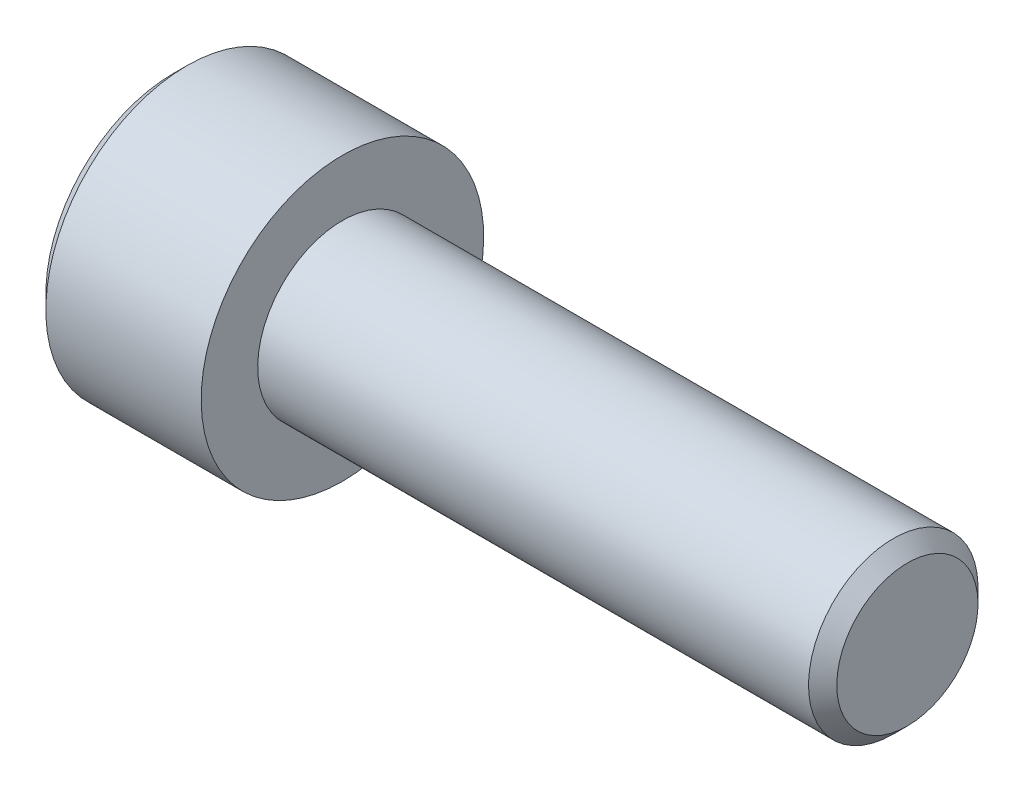
ISO-10303-21;
HEADER;
FILE_DESCRIPTION(('STEP AP214'),'2;1');
FILE_NAME('part.step','',(''),(''),'','','');
FILE_SCHEMA(('AUTOMOTIVE_DESIGN { 1 0 10303 214 1 1 1 1 }'));
ENDSEC;
DATA;
#1=APPLICATION_CONTEXT('core data for automotive mechanical design processes');
#2=APPLICATION_PROTOCOL_DEFINITION('international standard','automotive_design',2000,#1);
#3=PRODUCT_CONTEXT('',#1,'mechanical');
#4=PRODUCT('Part','Part','',(#3));
#5=PRODUCT_RELATED_PRODUCT_CATEGORY('part','',(#4));
#6=PRODUCT_DEFINITION_FORMATION('','',#4);
#7=PRODUCT_DEFINITION_CONTEXT('part definition',#1,'design');
#8=PRODUCT_DEFINITION('design','',#6,#7);
#9=PRODUCT_DEFINITION_SHAPE('','',#8);
#10=(LENGTH_UNIT() NAMED_UNIT(*) SI_UNIT(.MILLI.,.METRE.));
#11=(NAMED_UNIT(*) PLANE_ANGLE_UNIT() SI_UNIT($,.RADIAN.));
#12=(NAMED_UNIT(*) SI_UNIT($,.STERADIAN.) SOLID_ANGLE_UNIT());
#13=UNCERTAINTY_MEASURE_WITH_UNIT(LENGTH_MEASURE(1.E-05),#10,'distance_accuracy_value','');
#14=(GEOMETRIC_REPRESENTATION_CONTEXT(3) GLOBAL_UNCERTAINTY_ASSIGNED_CONTEXT((#13)) GLOBAL_UNIT_ASSIGNED_CONTEXT((#10,
#11,#12)) REPRESENTATION_CONTEXT('',''));
#15=CARTESIAN_POINT('',(0.,0.,0.));
#16=DIRECTION('',(0.,0.,1.));
#17=DIRECTION('',(1.,0.,0.));
#18=AXIS2_PLACEMENT_3D('',#15,#16,#17);
#19=CARTESIAN_POINT('',(-6.,0.,0.));
#20=DIRECTION('',(1.,0.,0.));
#21=DIRECTION('',(0.,1.,0.));
#22=AXIS2_PLACEMENT_3D('',#19,#20,#21);
#23=PLANE('',#22);
#24=CARTESIAN_POINT('',(-6.,0.,0.));
#25=DIRECTION('',(1.,0.,0.));
#26=DIRECTION('',(0.,1.,0.));
#27=AXIS2_PLACEMENT_3D('',#24,#25,#26);
#28=CIRCLE('',#27,4.49999999999999);
#29=CARTESIAN_POINT('',(-6.,4.49999999999999,0.));
#30=VERTEX_POINT('',#29);
#31=EDGE_CURVE('E40',#30,#30,#28,.F.);
#32=ORIENTED_EDGE('',*,*,#31,.T.);
#33=EDGE_LOOP('',(#32));
#34=FACE_BOUND('',#33,.T.);
#35=DIRECTION('',(0.,-0.5,-0.866025403784439));
#36=VECTOR('',#35,1.);
#37=CARTESIAN_POINT('',(-6.,2.88675134594813,0.));
#38=LINE('',#37,#36);
#39=CARTESIAN_POINT('',(-6.,2.88675134594813,0.));
#40=VERTEX_POINT('',#39);
#41=CARTESIAN_POINT('',(-6.,1.44337567297407,-2.5));
#42=VERTEX_POINT('',#41);
#43=EDGE_CURVE('E120',#40,#42,#38,.T.);
#44=ORIENTED_EDGE('',*,*,#43,.F.);
#45=DIRECTION('',(0.,0.5,-0.866025403784439));
#46=VECTOR('',#45,1.);
#47=CARTESIAN_POINT('',(-6.,1.44337567297407,2.5));
#48=LINE('',#47,#46);
#49=CARTESIAN_POINT('',(-6.,1.44337567297407,2.5));
#50=VERTEX_POINT('',#49);
#51=EDGE_CURVE('E47',#50,#40,#48,.T.);
#52=ORIENTED_EDGE('',*,*,#51,.F.);
#53=DIRECTION('',(0.,1.,0.));
#54=VECTOR('',#53,1.);
#55=CARTESIAN_POINT('',(-6.,-1.44337567297406,2.5));
#56=LINE('',#55,#54);
#57=CARTESIAN_POINT('',(-6.,-1.44337567297406,2.5));
#58=VERTEX_POINT('',#57);
#59=EDGE_CURVE('E106',#58,#50,#56,.T.);
#60=ORIENTED_EDGE('',*,*,#59,.F.);
#61=DIRECTION('',(0.,0.5,0.866025403784439));
#62=VECTOR('',#61,1.);
#63=CARTESIAN_POINT('',(-6.,-2.88675134594813,0.));
#64=LINE('',#63,#62);
#65=CARTESIAN_POINT('',(-6.,-2.88675134594813,0.));
#66=VERTEX_POINT('',#65);
#67=EDGE_CURVE('E109',#66,#58,#64,.T.);
#68=ORIENTED_EDGE('',*,*,#67,.F.);
#69=DIRECTION('',(0.,-0.5,0.866025403784439));
#70=VECTOR('',#69,1.);
#71=CARTESIAN_POINT('',(-6.,-1.44337567297406,-2.5));
#72=LINE('',#71,#70);
#73=CARTESIAN_POINT('',(-6.,-1.44337567297406,-2.5));
#74=VERTEX_POINT('',#73);
#75=EDGE_CURVE('E125',#74,#66,#72,.T.);
#76=ORIENTED_EDGE('',*,*,#75,.F.);
#77=DIRECTION('',(0.,-1.,0.));
#78=VECTOR('',#77,1.);
#79=CARTESIAN_POINT('',(-6.,1.44337567297407,-2.5));
#80=LINE('',#79,#78);
#81=EDGE_CURVE('E122',#42,#74,#80,.T.);
#82=ORIENTED_EDGE('',*,*,#81,.F.);
#83=EDGE_LOOP('',(#44,#52,#60,#68,#76,#82));
#84=FACE_BOUND('',#83,.T.);
#85=ADVANCED_FACE('F32',(#34,#84),#23,.F.);
#86=CARTESIAN_POINT('',(20.,0.,0.));
#87=DIRECTION('',(-1.,0.,0.));
#88=DIRECTION('',(0.,-1.,0.));
#89=AXIS2_PLACEMENT_3D('',#86,#87,#88);
#90=CYLINDRICAL_SURFACE('',#89,5.);
#91=CARTESIAN_POINT('',(-5.5,0.,0.));
#92=DIRECTION('',(1.,0.,0.));
#93=DIRECTION('',(0.,1.,0.));
#94=AXIS2_PLACEMENT_3D('',#91,#92,#93);
#95=CIRCLE('',#94,5.);
#96=CARTESIAN_POINT('',(-5.5,5.,0.));
#97=VERTEX_POINT('',#96);
#98=EDGE_CURVE('E11',#97,#97,#95,.T.);
#99=ORIENTED_EDGE('',*,*,#98,.T.);
#100=EDGE_LOOP('',(#99));
#101=FACE_BOUND('',#100,.T.);
#102=CARTESIAN_POINT('',(0.,0.,0.));
#103=DIRECTION('',(-1.,0.,0.));
#104=DIRECTION('',(0.,-1.,0.));
#105=AXIS2_PLACEMENT_3D('',#102,#103,#104);
#106=CIRCLE('',#105,5.);
#107=CARTESIAN_POINT('',(0.,-5.,0.));
#108=VERTEX_POINT('',#107);
#109=EDGE_CURVE('E145',#108,#108,#106,.T.);
#110=ORIENTED_EDGE('',*,*,#109,.T.);
#111=EDGE_LOOP('',(#110));
#112=FACE_BOUND('',#111,.T.);
#113=ADVANCED_FACE('F168',(#101,#112),#90,.T.);
#114=CARTESIAN_POINT('',(0.,5.,0.));
#115=DIRECTION('',(-1.,0.,0.));
#116=DIRECTION('',(0.,-1.,0.));
#117=AXIS2_PLACEMENT_3D('',#114,#115,#116);
#118=PLANE('',#117);
#119=ORIENTED_EDGE('',*,*,#109,.F.);
#120=EDGE_LOOP('',(#119));
#121=FACE_BOUND('',#120,.T.);
#122=CARTESIAN_POINT('',(0.,0.,0.));
#123=DIRECTION('',(-1.,0.,0.));
#124=DIRECTION('',(0.,-1.,0.));
#125=AXIS2_PLACEMENT_3D('',#122,#123,#124);
#126=CIRCLE('',#125,3.);
#127=CARTESIAN_POINT('',(0.,-3.,0.));
#128=VERTEX_POINT('',#127);
#129=EDGE_CURVE('E142',#128,#128,#126,.T.);
#130=ORIENTED_EDGE('',*,*,#129,.T.);
#131=EDGE_LOOP('',(#130));
#132=FACE_BOUND('',#131,.T.);
#133=ADVANCED_FACE('F173',(#121,#132),#118,.F.);
#134=CARTESIAN_POINT('',(20.,0.,0.));
#135=DIRECTION('',(-1.,0.,0.));
#136=DIRECTION('',(0.,-1.,0.));
#137=AXIS2_PLACEMENT_3D('',#134,#135,#136);
#138=CYLINDRICAL_SURFACE('',#137,3.);
#139=CARTESIAN_POINT('',(19.5,0.,0.));
#140=DIRECTION('',(-1.,0.,0.));
#141=DIRECTION('',(0.,-1.,0.));
#142=AXIS2_PLACEMENT_3D('',#139,#140,#141);
#143=CIRCLE('',#142,3.);
#144=CARTESIAN_POINT('',(19.5,-3.00000000000001,0.));
#145=VERTEX_POINT('',#144);
#146=EDGE_CURVE('E148',#145,#145,#143,.T.);
#147=ORIENTED_EDGE('',*,*,#146,.T.);
#148=EDGE_LOOP('',(#147));
#149=FACE_BOUND('',#148,.T.);
#150=ORIENTED_EDGE('',*,*,#129,.F.);
#151=EDGE_LOOP('',(#150));
#152=FACE_BOUND('',#151,.T.);
#153=ADVANCED_FACE('F179',(#149,#152),#138,.T.);
#154=CARTESIAN_POINT('',(20.,3.,0.));
#155=DIRECTION('',(-1.,0.,0.));
#156=DIRECTION('',(0.,-1.,0.));
#157=AXIS2_PLACEMENT_3D('',#154,#155,#156);
#158=PLANE('',#157);
#159=CARTESIAN_POINT('',(20.,0.,0.));
#160=DIRECTION('',(-1.,0.,0.));
#161=DIRECTION('',(0.,-1.,0.));
#162=AXIS2_PLACEMENT_3D('',#159,#160,#161);
#163=CIRCLE('',#162,2.49999999999999);
#164=CARTESIAN_POINT('',(20.,-2.5,0.));
#165=VERTEX_POINT('',#164);
#166=EDGE_CURVE('E151',#165,#165,#163,.F.);
#167=ORIENTED_EDGE('',*,*,#166,.T.);
#168=EDGE_LOOP('',(#167));
#169=FACE_BOUND('',#168,.T.);
#170=ADVANCED_FACE('F183',(#169),#158,.F.);
#171=CARTESIAN_POINT('',(-3.,1.44337567297407,2.5));
#172=DIRECTION('',(0.,0.866025403784439,0.5));
#173=DIRECTION('',(0.,-0.5,0.866025403784439));
#174=AXIS2_PLACEMENT_3D('',#171,#172,#173);
#175=PLANE('',#174);
#176=ORIENTED_EDGE('',*,*,#51,.T.);
#177=DIRECTION('',(-1.,0.,0.));
#178=VECTOR('',#177,1.);
#179=CARTESIAN_POINT('',(-3.,2.88675134594813,0.));
#180=LINE('',#179,#178);
#181=CARTESIAN_POINT('',(-3.,2.88675134594813,0.));
#182=VERTEX_POINT('',#181);
#183=EDGE_CURVE('E83',#182,#40,#180,.T.);
#184=ORIENTED_EDGE('',*,*,#183,.F.);
#185=DIRECTION('',(0.,0.5,-0.866025403784439));
#186=VECTOR('',#185,1.);
#187=CARTESIAN_POINT('',(-3.,1.44337567297407,2.5));
#188=LINE('',#187,#186);
#189=CARTESIAN_POINT('',(-3.,1.44337567297407,2.5));
#190=VERTEX_POINT('',#189);
#191=EDGE_CURVE('E87',#190,#182,#188,.T.);
#192=ORIENTED_EDGE('',*,*,#191,.F.);
#193=DIRECTION('',(-1.,0.,0.));
#194=VECTOR('',#193,1.);
#195=CARTESIAN_POINT('',(-3.,1.44337567297407,2.5));
#196=LINE('',#195,#194);
#197=EDGE_CURVE('E130',#190,#50,#196,.T.);
#198=ORIENTED_EDGE('',*,*,#197,.T.);
#199=EDGE_LOOP('',(#176,#184,#192,#198));
#200=FACE_BOUND('',#199,.T.);
#201=ADVANCED_FACE('F85',(#200),#175,.F.);
#202=CARTESIAN_POINT('',(-3.,-1.44337567297406,2.5));
#203=DIRECTION('',(0.,0.,1.));
#204=DIRECTION('',(0.,-1.,0.));
#205=AXIS2_PLACEMENT_3D('',#202,#203,#204);
#206=PLANE('',#205);
#207=ORIENTED_EDGE('',*,*,#59,.T.);
#208=ORIENTED_EDGE('',*,*,#197,.F.);
#209=DIRECTION('',(0.,1.,0.));
#210=VECTOR('',#209,1.);
#211=CARTESIAN_POINT('',(-3.,-1.44337567297406,2.5));
#212=LINE('',#211,#210);
#213=CARTESIAN_POINT('',(-3.,-1.44337567297406,2.5));
#214=VERTEX_POINT('',#213);
#215=EDGE_CURVE('E93',#214,#190,#212,.T.);
#216=ORIENTED_EDGE('',*,*,#215,.F.);
#217=DIRECTION('',(-1.,0.,0.));
#218=VECTOR('',#217,1.);
#219=CARTESIAN_POINT('',(-3.,-1.44337567297406,2.5));
#220=LINE('',#219,#218);
#221=EDGE_CURVE('E133',#214,#58,#220,.T.);
#222=ORIENTED_EDGE('',*,*,#221,.T.);
#223=EDGE_LOOP('',(#207,#208,#216,#222));
#224=FACE_BOUND('',#223,.T.);
#225=ADVANCED_FACE('F193',(#224),#206,.F.);
#226=CARTESIAN_POINT('',(-3.,-2.88675134594813,0.));
#227=DIRECTION('',(0.,-0.866025403784439,0.5));
#228=DIRECTION('',(0.,-0.5,-0.866025403784439));
#229=AXIS2_PLACEMENT_3D('',#226,#227,#228);
#230=PLANE('',#229);
#231=ORIENTED_EDGE('',*,*,#67,.T.);
#232=ORIENTED_EDGE('',*,*,#221,.F.);
#233=DIRECTION('',(0.,0.5,0.866025403784439));
#234=VECTOR('',#233,1.);
#235=CARTESIAN_POINT('',(-3.,-2.88675134594813,0.));
#236=LINE('',#235,#234);
#237=CARTESIAN_POINT('',(-3.,-2.88675134594813,0.));
#238=VERTEX_POINT('',#237);
#239=EDGE_CURVE('E116',#238,#214,#236,.T.);
#240=ORIENTED_EDGE('',*,*,#239,.F.);
#241=DIRECTION('',(-1.,0.,0.));
#242=VECTOR('',#241,1.);
#243=CARTESIAN_POINT('',(-3.,-2.88675134594813,0.));
#244=LINE('',#243,#242);
#245=EDGE_CURVE('E135',#238,#66,#244,.T.);
#246=ORIENTED_EDGE('',*,*,#245,.T.);
#247=EDGE_LOOP('',(#231,#232,#240,#246));
#248=FACE_BOUND('',#247,.T.);
#249=ADVANCED_FACE('F203',(#248),#230,.F.);
#250=CARTESIAN_POINT('',(-3.,-1.44337567297406,-2.5));
#251=DIRECTION('',(0.,-0.866025403784438,-0.5));
#252=DIRECTION('',(0.,0.5,-0.866025403784439));
#253=AXIS2_PLACEMENT_3D('',#250,#251,#252);
#254=PLANE('',#253);
#255=ORIENTED_EDGE('',*,*,#75,.T.);
#256=ORIENTED_EDGE('',*,*,#245,.F.);
#257=DIRECTION('',(0.,-0.5,0.866025403784439));
#258=VECTOR('',#257,1.);
#259=CARTESIAN_POINT('',(-3.,-1.44337567297406,-2.5));
#260=LINE('',#259,#258);
#261=CARTESIAN_POINT('',(-3.,-1.44337567297406,-2.5));
#262=VERTEX_POINT('',#261);
#263=EDGE_CURVE('E113',#262,#238,#260,.T.);
#264=ORIENTED_EDGE('',*,*,#263,.F.);
#265=DIRECTION('',(-1.,0.,0.));
#266=VECTOR('',#265,1.);
#267=CARTESIAN_POINT('',(-3.,-1.44337567297406,-2.5));
#268=LINE('',#267,#266);
#269=EDGE_CURVE('E137',#262,#74,#268,.T.);
#270=ORIENTED_EDGE('',*,*,#269,.T.);
#271=EDGE_LOOP('',(#255,#256,#264,#270));
#272=FACE_BOUND('',#271,.T.);
#273=ADVANCED_FACE('F199',(#272),#254,.F.);
#274=CARTESIAN_POINT('',(-3.,1.44337567297407,-2.5));
#275=DIRECTION('',(0.,0.,-1.));
#276=DIRECTION('',(-1.,0.,0.));
#277=AXIS2_PLACEMENT_3D('',#274,#275,#276);
#278=PLANE('',#277);
#279=ORIENTED_EDGE('',*,*,#81,.T.);
#280=ORIENTED_EDGE('',*,*,#269,.F.);
#281=DIRECTION('',(0.,-1.,0.));
#282=VECTOR('',#281,1.);
#283=CARTESIAN_POINT('',(-3.,1.44337567297407,-2.5));
#284=LINE('',#283,#282);
#285=CARTESIAN_POINT('',(-3.,1.44337567297407,-2.5));
#286=VERTEX_POINT('',#285);
#287=EDGE_CURVE('E101',#286,#262,#284,.T.);
#288=ORIENTED_EDGE('',*,*,#287,.F.);
#289=DIRECTION('',(-1.,0.,0.));
#290=VECTOR('',#289,1.);
#291=CARTESIAN_POINT('',(-3.,1.44337567297407,-2.5));
#292=LINE('',#291,#290);
#293=EDGE_CURVE('E92',#286,#42,#292,.T.);
#294=ORIENTED_EDGE('',*,*,#293,.T.);
#295=EDGE_LOOP('',(#279,#280,#288,#294));
#296=FACE_BOUND('',#295,.T.);
#297=ADVANCED_FACE('F196',(#296),#278,.F.);
#298=CARTESIAN_POINT('',(-3.,2.88675134594813,0.));
#299=DIRECTION('',(0.,0.866025403784439,-0.5));
#300=DIRECTION('',(0.,0.5,0.866025403784439));
#301=AXIS2_PLACEMENT_3D('',#298,#299,#300);
#302=PLANE('',#301);
#303=ORIENTED_EDGE('',*,*,#43,.T.);
#304=ORIENTED_EDGE('',*,*,#293,.F.);
#305=DIRECTION('',(0.,-0.5,-0.866025403784439));
#306=VECTOR('',#305,1.);
#307=CARTESIAN_POINT('',(-3.,2.88675134594813,0.));
#308=LINE('',#307,#306);
#309=EDGE_CURVE('E96',#182,#286,#308,.T.);
#310=ORIENTED_EDGE('',*,*,#309,.F.);
#311=ORIENTED_EDGE('',*,*,#183,.T.);
#312=EDGE_LOOP('',(#303,#304,#310,#311));
#313=FACE_BOUND('',#312,.T.);
#314=ADVANCED_FACE('F97',(#313),#302,.F.);
#315=CARTESIAN_POINT('',(-3.,2.88675134594813,0.));
#316=DIRECTION('',(-1.,0.,0.));
#317=DIRECTION('',(0.,0.,1.));
#318=AXIS2_PLACEMENT_3D('',#315,#316,#317);
#319=PLANE('',#318);
#320=CARTESIAN_POINT('',(-3.,0.,0.));
#321=DIRECTION('',(-1.,0.,0.));
#322=DIRECTION('',(0.,0.,1.));
#323=AXIS2_PLACEMENT_3D('',#320,#321,#322);
#324=CIRCLE('',#323,2.495);
#325=CARTESIAN_POINT('',(-3.,0.,2.495));
#326=VERTEX_POINT('',#325);
#327=EDGE_CURVE('E132',#326,#326,#324,.T.);
#328=ORIENTED_EDGE('',*,*,#327,.F.);
#329=EDGE_LOOP('',(#328));
#330=FACE_BOUND('',#329,.T.);
#331=ORIENTED_EDGE('',*,*,#191,.T.);
#332=ORIENTED_EDGE('',*,*,#309,.T.);
#333=ORIENTED_EDGE('',*,*,#287,.T.);
#334=ORIENTED_EDGE('',*,*,#263,.T.);
#335=ORIENTED_EDGE('',*,*,#239,.T.);
#336=ORIENTED_EDGE('',*,*,#215,.T.);
#337=EDGE_LOOP('',(#331,#332,#333,#334,#335,#336));
#338=FACE_BOUND('',#337,.T.);
#339=ADVANCED_FACE('F103',(#330,#338),#319,.T.);
#340=CARTESIAN_POINT('',(-2.33146676488434,0.,0.));
#341=DIRECTION('',(-1.,0.,0.));
#342=DIRECTION('',(0.,0.,1.));
#343=AXIS2_PLACEMENT_3D('',#340,#341,#342);
#344=CONICAL_SURFACE('',#343,0.,1.30899693899574);
#345=ORIENTED_EDGE('',*,*,#327,.T.);
#346=EDGE_LOOP('',(#345));
#347=FACE_BOUND('',#346,.T.);
#348=CARTESIAN_POINT('',(-2.33146676488434,0.,0.));
#349=VERTEX_POINT('',#348);
#350=VERTEX_LOOP('',#349);
#351=FACE_BOUND('',#350,.T.);
#352=ADVANCED_FACE('F164',(#347,#351),#344,.F.);
#353=CARTESIAN_POINT('',(19.5,0.,0.));
#354=DIRECTION('',(-1.,0.,0.));
#355=DIRECTION('',(0.,-1.,0.));
#356=AXIS2_PLACEMENT_3D('',#353,#354,#355);
#357=CONICAL_SURFACE('',#356,3.,0.785398163397457);
#358=ORIENTED_EDGE('',*,*,#166,.F.);
#359=EDGE_LOOP('',(#358));
#360=FACE_BOUND('',#359,.T.);
#361=ORIENTED_EDGE('',*,*,#146,.F.);
#362=EDGE_LOOP('',(#361));
#363=FACE_BOUND('',#362,.T.);
#364=ADVANCED_FACE('F159',(#360,#363),#357,.T.);
#365=CARTESIAN_POINT('',(-6.,0.,0.));
#366=DIRECTION('',(1.,0.,0.));
#367=DIRECTION('',(0.,1.,0.));
#368=AXIS2_PLACEMENT_3D('',#365,#366,#367);
#369=CONICAL_SURFACE('',#368,4.5,0.785398163397452);
#370=ORIENTED_EDGE('',*,*,#98,.F.);
#371=EDGE_LOOP('',(#370));
#372=FACE_BOUND('',#371,.T.);
#373=ORIENTED_EDGE('',*,*,#31,.F.);
#374=EDGE_LOOP('',(#373));
#375=FACE_BOUND('',#374,.T.);
#376=ADVANCED_FACE('F34',(#372,#375),#369,.T.);
#377=CLOSED_SHELL('',(#85,#113,#133,#153,#170,#201,#225,#249,#273,#297,#314,#339,#352,#364,#376));
#378=MANIFOLD_SOLID_BREP('B2',#377);
#379=ADVANCED_BREP_SHAPE_REPRESENTATION('',(#18,#378),#14);
#380=SHAPE_DEFINITION_REPRESENTATION(#9,#379);
ENDSEC;
END-ISO-10303-21;
